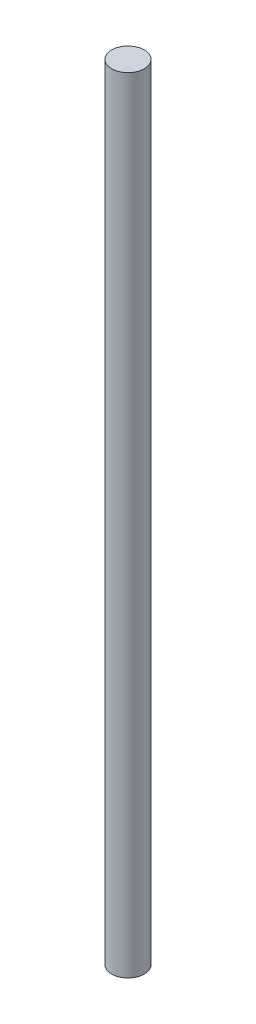
ISO-10303-21;
HEADER;
FILE_DESCRIPTION(('STEP AP214'),'2;1');
FILE_NAME('part.step','',(''),(''),'','','');
FILE_SCHEMA(('AUTOMOTIVE_DESIGN { 1 0 10303 214 1 1 1 1 }'));
ENDSEC;
DATA;
#1=APPLICATION_CONTEXT('core data for automotive mechanical design processes');
#2=APPLICATION_PROTOCOL_DEFINITION('international standard','automotive_design',2000,#1);
#3=PRODUCT_CONTEXT('',#1,'mechanical');
#4=PRODUCT('Part','Part','',(#3));
#5=PRODUCT_RELATED_PRODUCT_CATEGORY('part','',(#4));
#6=PRODUCT_DEFINITION_FORMATION('','',#4);
#7=PRODUCT_DEFINITION_CONTEXT('part definition',#1,'design');
#8=PRODUCT_DEFINITION('design','',#6,#7);
#9=PRODUCT_DEFINITION_SHAPE('','',#8);
#10=(LENGTH_UNIT() NAMED_UNIT(*) SI_UNIT(.MILLI.,.METRE.));
#11=(NAMED_UNIT(*) PLANE_ANGLE_UNIT() SI_UNIT($,.RADIAN.));
#12=(NAMED_UNIT(*) SI_UNIT($,.STERADIAN.) SOLID_ANGLE_UNIT());
#13=UNCERTAINTY_MEASURE_WITH_UNIT(LENGTH_MEASURE(1.E-05),#10,'distance_accuracy_value','');
#14=(GEOMETRIC_REPRESENTATION_CONTEXT(3) GLOBAL_UNCERTAINTY_ASSIGNED_CONTEXT((#13)) GLOBAL_UNIT_ASSIGNED_CONTEXT((#10,
#11,#12)) REPRESENTATION_CONTEXT('',''));
#15=CARTESIAN_POINT('',(0.,0.,0.));
#16=DIRECTION('',(0.,0.,1.));
#17=DIRECTION('',(1.,0.,0.));
#18=AXIS2_PLACEMENT_3D('',#15,#16,#17);
#19=CARTESIAN_POINT('',(0.,24.,0.));
#20=DIRECTION('',(0.,-1.,0.));
#21=DIRECTION('',(0.,0.,-1.));
#22=AXIS2_PLACEMENT_3D('',#19,#20,#21);
#23=CYLINDRICAL_SURFACE('',#22,0.5);
#24=CARTESIAN_POINT('',(0.,24.,0.));
#25=DIRECTION('',(0.,1.,0.));
#26=DIRECTION('',(0.,0.,1.));
#27=AXIS2_PLACEMENT_3D('',#24,#25,#26);
#28=CIRCLE('',#27,0.5);
#29=CARTESIAN_POINT('',(0.,24.,0.5));
#30=VERTEX_POINT('',#29);
#31=EDGE_CURVE('E10',#30,#30,#28,.T.);
#32=ORIENTED_EDGE('',*,*,#31,.F.);
#33=EDGE_LOOP('',(#32));
#34=FACE_BOUND('',#33,.T.);
#35=CARTESIAN_POINT('',(0.,0.,0.));
#36=DIRECTION('',(0.,1.,0.));
#37=DIRECTION('',(0.,0.,1.));
#38=AXIS2_PLACEMENT_3D('',#35,#36,#37);
#39=CIRCLE('',#38,0.5);
#40=CARTESIAN_POINT('',(0.,0.,0.5));
#41=VERTEX_POINT('',#40);
#42=EDGE_CURVE('E33',#41,#41,#39,.T.);
#43=ORIENTED_EDGE('',*,*,#42,.T.);
#44=EDGE_LOOP('',(#43));
#45=FACE_BOUND('',#44,.T.);
#46=ADVANCED_FACE('F30',(#34,#45),#23,.T.);
#47=CARTESIAN_POINT('',(0.,24.,0.));
#48=DIRECTION('',(0.,1.,0.));
#49=DIRECTION('',(0.,0.,1.));
#50=AXIS2_PLACEMENT_3D('',#47,#48,#49);
#51=PLANE('',#50);
#52=ORIENTED_EDGE('',*,*,#31,.T.);
#53=EDGE_LOOP('',(#52));
#54=FACE_BOUND('',#53,.T.);
#55=ADVANCED_FACE('F45',(#54),#51,.T.);
#56=CARTESIAN_POINT('',(0.,0.,0.));
#57=DIRECTION('',(0.,1.,0.));
#58=DIRECTION('',(0.,0.,1.));
#59=AXIS2_PLACEMENT_3D('',#56,#57,#58);
#60=PLANE('',#59);
#61=ORIENTED_EDGE('',*,*,#42,.F.);
#62=EDGE_LOOP('',(#61));
#63=FACE_BOUND('',#62,.T.);
#64=ADVANCED_FACE('F43',(#63),#60,.F.);
#65=CLOSED_SHELL('',(#46,#55,#64));
#66=MANIFOLD_SOLID_BREP('B2',#65);
#67=ADVANCED_BREP_SHAPE_REPRESENTATION('',(#18,#66),#14);
#68=SHAPE_DEFINITION_REPRESENTATION(#9,#67);
ENDSEC;
END-ISO-10303-21;
